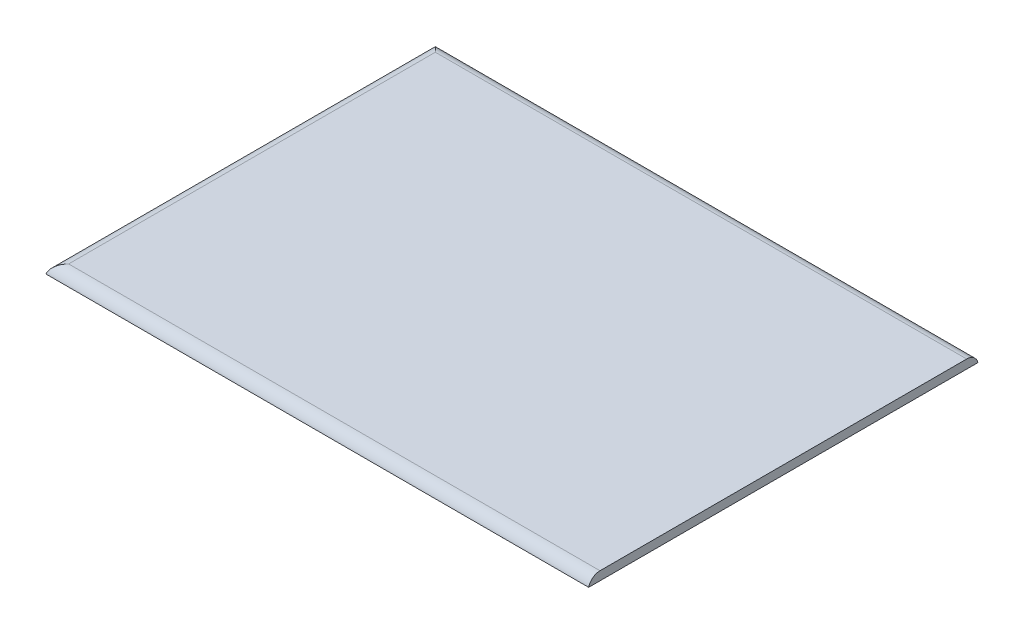
ISO-10303-21;
HEADER;
FILE_DESCRIPTION(('STEP AP214'),'2;1');
FILE_NAME('part.step','',(''),(''),'','','');
FILE_SCHEMA(('AUTOMOTIVE_DESIGN { 1 0 10303 214 1 1 1 1 }'));
ENDSEC;
DATA;
#1=APPLICATION_CONTEXT('core data for automotive mechanical design processes');
#2=APPLICATION_PROTOCOL_DEFINITION('international standard','automotive_design',2000,#1);
#3=PRODUCT_CONTEXT('',#1,'mechanical');
#4=PRODUCT('Part','Part','',(#3));
#5=PRODUCT_RELATED_PRODUCT_CATEGORY('part','',(#4));
#6=PRODUCT_DEFINITION_FORMATION('','',#4);
#7=PRODUCT_DEFINITION_CONTEXT('part definition',#1,'design');
#8=PRODUCT_DEFINITION('design','',#6,#7);
#9=PRODUCT_DEFINITION_SHAPE('','',#8);
#10=(LENGTH_UNIT() NAMED_UNIT(*) SI_UNIT(.MILLI.,.METRE.));
#11=(NAMED_UNIT(*) PLANE_ANGLE_UNIT() SI_UNIT($,.RADIAN.));
#12=(NAMED_UNIT(*) SI_UNIT($,.STERADIAN.) SOLID_ANGLE_UNIT());
#13=UNCERTAINTY_MEASURE_WITH_UNIT(LENGTH_MEASURE(1.E-05),#10,'distance_accuracy_value','');
#14=(GEOMETRIC_REPRESENTATION_CONTEXT(3) GLOBAL_UNCERTAINTY_ASSIGNED_CONTEXT((#13)) GLOBAL_UNIT_ASSIGNED_CONTEXT((#10,
#11,#12)) REPRESENTATION_CONTEXT('',''));
#15=CARTESIAN_POINT('',(0.,0.,0.));
#16=DIRECTION('',(0.,0.,1.));
#17=DIRECTION('',(1.,0.,0.));
#18=AXIS2_PLACEMENT_3D('',#15,#16,#17);
#19=CARTESIAN_POINT('',(46.5,1.25,-33.4));
#20=DIRECTION('',(-1.,0.,0.));
#21=DIRECTION('',(0.,0.,1.));
#22=AXIS2_PLACEMENT_3D('',#19,#20,#21);
#23=PLANE('',#22);
#24=DIRECTION('',(0.,0.,1.));
#25=VECTOR('',#24,1.);
#26=CARTESIAN_POINT('',(46.5,-0.25,33.4));
#27=LINE('',#26,#25);
#28=CARTESIAN_POINT('',(46.5,-0.25,-33.3364916731037));
#29=VERTEX_POINT('',#28);
#30=CARTESIAN_POINT('',(46.5,-0.25,33.3364916731037));
#31=VERTEX_POINT('',#30);
#32=EDGE_CURVE('E88',#29,#31,#27,.T.);
#33=ORIENTED_EDGE('',*,*,#32,.F.);
#34=CARTESIAN_POINT('',(46.5,-0.75,-31.4));
#35=DIRECTION('',(-1.,0.,0.));
#36=DIRECTION('',(0.,0.,1.));
#37=AXIS2_PLACEMENT_3D('',#34,#35,#36);
#38=CIRCLE('',#37,2.);
#39=CARTESIAN_POINT('',(46.5,1.25,-31.4));
#40=VERTEX_POINT('',#39);
#41=EDGE_CURVE('E55',#29,#40,#38,.F.);
#42=ORIENTED_EDGE('',*,*,#41,.T.);
#43=DIRECTION('',(0.,0.,-1.));
#44=VECTOR('',#43,1.);
#45=CARTESIAN_POINT('',(46.5,1.25,-33.4));
#46=LINE('',#45,#44);
#47=CARTESIAN_POINT('',(46.5,1.25,31.4));
#48=VERTEX_POINT('',#47);
#49=EDGE_CURVE('E114',#48,#40,#46,.T.);
#50=ORIENTED_EDGE('',*,*,#49,.F.);
#51=CARTESIAN_POINT('',(46.5,-0.75,31.4));
#52=DIRECTION('',(-1.,0.,0.));
#53=DIRECTION('',(0.,0.,1.));
#54=AXIS2_PLACEMENT_3D('',#51,#52,#53);
#55=CIRCLE('',#54,2.);
#56=EDGE_CURVE('E96',#48,#31,#55,.F.);
#57=ORIENTED_EDGE('',*,*,#56,.T.);
#58=EDGE_LOOP('',(#33,#42,#50,#57));
#59=FACE_BOUND('',#58,.T.);
#60=ADVANCED_FACE('F45',(#59),#23,.F.);
#61=CARTESIAN_POINT('',(0.,-0.75,31.4));
#62=DIRECTION('',(-1.,0.,0.));
#63=DIRECTION('',(0.,0.,1.));
#64=AXIS2_PLACEMENT_3D('',#61,#62,#63);
#65=CYLINDRICAL_SURFACE('',#64,2.);
#66=CARTESIAN_POINT('',(-44.5,-0.75,31.4));
#67=DIRECTION('',(-0.707106781186547,0.,-0.707106781186547));
#68=DIRECTION('',(-0.707106781186547,0.,0.707106781186547));
#69=AXIS2_PLACEMENT_3D('',#66,#67,#68);
#70=ELLIPSE('',#69,2.82842712474619,2.);
#71=CARTESIAN_POINT('',(-46.4364916731037,-0.25,33.3364916731037));
#72=VERTEX_POINT('',#71);
#73=CARTESIAN_POINT('',(-44.5,1.25,31.4));
#74=VERTEX_POINT('',#73);
#75=EDGE_CURVE('E111',#72,#74,#70,.T.);
#76=ORIENTED_EDGE('',*,*,#75,.F.);
#77=DIRECTION('',(-1.,0.,0.));
#78=VECTOR('',#77,1.);
#79=CARTESIAN_POINT('',(0.,-0.25,33.3364916731037));
#80=LINE('',#79,#78);
#81=EDGE_CURVE('E112',#72,#31,#80,.F.);
#82=ORIENTED_EDGE('',*,*,#81,.T.);
#83=ORIENTED_EDGE('',*,*,#56,.F.);
#84=DIRECTION('',(1.,0.,0.));
#85=VECTOR('',#84,1.);
#86=CARTESIAN_POINT('',(46.5,1.25,31.4));
#87=LINE('',#86,#85);
#88=EDGE_CURVE('E187',#74,#48,#87,.T.);
#89=ORIENTED_EDGE('',*,*,#88,.F.);
#90=EDGE_LOOP('',(#76,#82,#83,#89));
#91=FACE_BOUND('',#90,.T.);
#92=ADVANCED_FACE('F47',(#91),#65,.T.);
#93=CARTESIAN_POINT('',(-44.5,-0.75,0.));
#94=DIRECTION('',(0.,0.,-1.));
#95=DIRECTION('',(-1.,0.,0.));
#96=AXIS2_PLACEMENT_3D('',#93,#94,#95);
#97=CYLINDRICAL_SURFACE('',#96,2.);
#98=CARTESIAN_POINT('',(-44.5,-0.75,-31.4));
#99=DIRECTION('',(0.707106781186547,0.,-0.707106781186547));
#100=DIRECTION('',(-0.707106781186547,0.,-0.707106781186547));
#101=AXIS2_PLACEMENT_3D('',#98,#99,#100);
#102=ELLIPSE('',#101,2.82842712474619,2.);
#103=CARTESIAN_POINT('',(-46.4364916731037,-0.25,-33.3364916731037));
#104=VERTEX_POINT('',#103);
#105=CARTESIAN_POINT('',(-44.5,1.25,-31.4));
#106=VERTEX_POINT('',#105);
#107=EDGE_CURVE('E69',#104,#106,#102,.T.);
#108=ORIENTED_EDGE('',*,*,#107,.F.);
#109=DIRECTION('',(0.,0.,-1.));
#110=VECTOR('',#109,1.);
#111=CARTESIAN_POINT('',(-46.4364916731037,-0.25,0.));
#112=LINE('',#111,#110);
#113=EDGE_CURVE('E63',#104,#72,#112,.F.);
#114=ORIENTED_EDGE('',*,*,#113,.T.);
#115=ORIENTED_EDGE('',*,*,#75,.T.);
#116=DIRECTION('',(0.,0.,1.));
#117=VECTOR('',#116,1.);
#118=CARTESIAN_POINT('',(-44.5,1.25,33.4));
#119=LINE('',#118,#117);
#120=EDGE_CURVE('E190',#106,#74,#119,.T.);
#121=ORIENTED_EDGE('',*,*,#120,.F.);
#122=EDGE_LOOP('',(#108,#114,#115,#121));
#123=FACE_BOUND('',#122,.T.);
#124=ADVANCED_FACE('F200',(#123),#97,.T.);
#125=CARTESIAN_POINT('',(0.,-0.75,-31.4));
#126=DIRECTION('',(1.,0.,0.));
#127=DIRECTION('',(0.,0.,-1.));
#128=AXIS2_PLACEMENT_3D('',#125,#126,#127);
#129=CYLINDRICAL_SURFACE('',#128,2.);
#130=ORIENTED_EDGE('',*,*,#41,.F.);
#131=DIRECTION('',(1.,0.,0.));
#132=VECTOR('',#131,1.);
#133=CARTESIAN_POINT('',(0.,-0.25,-33.3364916731037));
#134=LINE('',#133,#132);
#135=EDGE_CURVE('E11',#29,#104,#134,.F.);
#136=ORIENTED_EDGE('',*,*,#135,.T.);
#137=ORIENTED_EDGE('',*,*,#107,.T.);
#138=DIRECTION('',(-1.,0.,0.));
#139=VECTOR('',#138,1.);
#140=CARTESIAN_POINT('',(-46.5,1.25,-31.4));
#141=LINE('',#140,#139);
#142=EDGE_CURVE('E102',#40,#106,#141,.T.);
#143=ORIENTED_EDGE('',*,*,#142,.F.);
#144=EDGE_LOOP('',(#130,#136,#137,#143));
#145=FACE_BOUND('',#144,.T.);
#146=ADVANCED_FACE('F100',(#145),#129,.T.);
#147=CARTESIAN_POINT('',(0.,1.25,0.));
#148=DIRECTION('',(0.,1.,0.));
#149=DIRECTION('',(0.,0.,1.));
#150=AXIS2_PLACEMENT_3D('',#147,#148,#149);
#151=PLANE('',#150);
#152=ORIENTED_EDGE('',*,*,#49,.T.);
#153=ORIENTED_EDGE('',*,*,#142,.T.);
#154=ORIENTED_EDGE('',*,*,#120,.T.);
#155=ORIENTED_EDGE('',*,*,#88,.T.);
#156=EDGE_LOOP('',(#152,#153,#154,#155));
#157=FACE_BOUND('',#156,.T.);
#158=ADVANCED_FACE('F195',(#157),#151,.T.);
#159=CARTESIAN_POINT('',(0.,-0.25,0.));
#160=DIRECTION('',(0.,-1.,0.));
#161=DIRECTION('',(0.,0.,-1.));
#162=AXIS2_PLACEMENT_3D('',#159,#160,#161);
#163=PLANE('',#162);
#164=CARTESIAN_POINT('',(-37.55,-0.25,-19.6135083268963));
#165=DIRECTION('',(0.,-1.,0.));
#166=DIRECTION('',(0.,0.,-1.));
#167=AXIS2_PLACEMENT_3D('',#164,#165,#166);
#168=CIRCLE('',#167,2.5);
#169=CARTESIAN_POINT('',(-37.55,-0.25,-22.1135083268963));
#170=VERTEX_POINT('',#169);
#171=EDGE_CURVE('E336',#170,#170,#168,.T.);
#172=ORIENTED_EDGE('',*,*,#171,.F.);
#173=EDGE_LOOP('',(#172));
#174=FACE_BOUND('',#173,.T.);
#175=CARTESIAN_POINT('',(17.55,-0.25,-19.6135083268963));
#176=DIRECTION('',(0.,-1.,0.));
#177=DIRECTION('',(0.,0.,-1.));
#178=AXIS2_PLACEMENT_3D('',#175,#176,#177);
#179=CIRCLE('',#178,2.5);
#180=CARTESIAN_POINT('',(17.55,-0.25,-22.1135083268963));
#181=VERTEX_POINT('',#180);
#182=EDGE_CURVE('E326',#181,#181,#179,.T.);
#183=ORIENTED_EDGE('',*,*,#182,.F.);
#184=EDGE_LOOP('',(#183));
#185=FACE_BOUND('',#184,.T.);
#186=CARTESIAN_POINT('',(17.55,-0.25,26.4864916731037));
#187=DIRECTION('',(0.,-1.,0.));
#188=DIRECTION('',(0.,0.,-1.));
#189=AXIS2_PLACEMENT_3D('',#186,#187,#188);
#190=CIRCLE('',#189,2.5);
#191=CARTESIAN_POINT('',(17.55,-0.25,23.9864916731037));
#192=VERTEX_POINT('',#191);
#193=EDGE_CURVE('E317',#192,#192,#190,.T.);
#194=ORIENTED_EDGE('',*,*,#193,.F.);
#195=EDGE_LOOP('',(#194));
#196=FACE_BOUND('',#195,.T.);
#197=CARTESIAN_POINT('',(-37.55,-0.25,26.4864916731037));
#198=DIRECTION('',(0.,-1.,0.));
#199=DIRECTION('',(0.,0.,-1.));
#200=AXIS2_PLACEMENT_3D('',#197,#198,#199);
#201=CIRCLE('',#200,2.5);
#202=CARTESIAN_POINT('',(-37.55,-0.25,23.9864916731037));
#203=VERTEX_POINT('',#202);
#204=EDGE_CURVE('E320',#203,#203,#201,.T.);
#205=ORIENTED_EDGE('',*,*,#204,.F.);
#206=EDGE_LOOP('',(#205));
#207=FACE_BOUND('',#206,.T.);
#208=CARTESIAN_POINT('',(-43.5,-0.25,-30.4));
#209=DIRECTION('',(0.,-1.,0.));
#210=DIRECTION('',(0.,0.,-1.));
#211=AXIS2_PLACEMENT_3D('',#208,#209,#210);
#212=CIRCLE('',#211,1.00000000000001);
#213=CARTESIAN_POINT('',(-43.5,-0.25,-31.4));
#214=VERTEX_POINT('',#213);
#215=EDGE_CURVE('E168',#214,#214,#212,.T.);
#216=ORIENTED_EDGE('',*,*,#215,.F.);
#217=EDGE_LOOP('',(#216));
#218=FACE_BOUND('',#217,.T.);
#219=CARTESIAN_POINT('',(43.5,-0.25,-30.4));
#220=DIRECTION('',(0.,-1.,0.));
#221=DIRECTION('',(0.,0.,-1.));
#222=AXIS2_PLACEMENT_3D('',#219,#220,#221);
#223=CIRCLE('',#222,0.999999999999998);
#224=CARTESIAN_POINT('',(43.5,-0.25,-31.4));
#225=VERTEX_POINT('',#224);
#226=EDGE_CURVE('E160',#225,#225,#223,.T.);
#227=ORIENTED_EDGE('',*,*,#226,.F.);
#228=EDGE_LOOP('',(#227));
#229=FACE_BOUND('',#228,.T.);
#230=CARTESIAN_POINT('',(43.5,-0.25,30.4));
#231=DIRECTION('',(0.,-1.,0.));
#232=DIRECTION('',(0.,0.,-1.));
#233=AXIS2_PLACEMENT_3D('',#230,#231,#232);
#234=CIRCLE('',#233,0.999999999999992);
#235=CARTESIAN_POINT('',(43.5,-0.25,29.4));
#236=VERTEX_POINT('',#235);
#237=EDGE_CURVE('E151',#236,#236,#234,.T.);
#238=ORIENTED_EDGE('',*,*,#237,.F.);
#239=EDGE_LOOP('',(#238));
#240=FACE_BOUND('',#239,.T.);
#241=CARTESIAN_POINT('',(-43.5,-0.25,30.4));
#242=DIRECTION('',(0.,-1.,0.));
#243=DIRECTION('',(0.,0.,-1.));
#244=AXIS2_PLACEMENT_3D('',#241,#242,#243);
#245=CIRCLE('',#244,0.999999999999998);
#246=CARTESIAN_POINT('',(-43.5,-0.25,29.4));
#247=VERTEX_POINT('',#246);
#248=EDGE_CURVE('E155',#247,#247,#245,.T.);
#249=ORIENTED_EDGE('',*,*,#248,.F.);
#250=EDGE_LOOP('',(#249));
#251=FACE_BOUND('',#250,.T.);
#252=ORIENTED_EDGE('',*,*,#113,.F.);
#253=ORIENTED_EDGE('',*,*,#135,.F.);
#254=ORIENTED_EDGE('',*,*,#32,.T.);
#255=ORIENTED_EDGE('',*,*,#81,.F.);
#256=EDGE_LOOP('',(#252,#253,#254,#255));
#257=FACE_BOUND('',#256,.T.);
#258=ADVANCED_FACE('F87',(#174,#185,#196,#207,#218,#229,#240,#251,#257),#163,.T.);
#259=CARTESIAN_POINT('',(-43.5,0.5,30.4));
#260=DIRECTION('',(0.,-1.,0.));
#261=DIRECTION('',(0.,0.,-1.));
#262=AXIS2_PLACEMENT_3D('',#259,#260,#261);
#263=CYLINDRICAL_SURFACE('',#262,0.999999999999998);
#264=CARTESIAN_POINT('',(-43.5,0.5,30.4));
#265=DIRECTION('',(0.,-1.,0.));
#266=DIRECTION('',(0.,0.,-1.));
#267=AXIS2_PLACEMENT_3D('',#264,#265,#266);
#268=CIRCLE('',#267,0.999999999999998);
#269=CARTESIAN_POINT('',(-43.5,0.5,29.4));
#270=VERTEX_POINT('',#269);
#271=EDGE_CURVE('E98',#270,#270,#268,.T.);
#272=ORIENTED_EDGE('',*,*,#271,.F.);
#273=EDGE_LOOP('',(#272));
#274=FACE_BOUND('',#273,.T.);
#275=ORIENTED_EDGE('',*,*,#248,.T.);
#276=EDGE_LOOP('',(#275));
#277=FACE_BOUND('',#276,.T.);
#278=ADVANCED_FACE('F216',(#274,#277),#263,.F.);
#279=CARTESIAN_POINT('',(-43.5,0.5,30.4));
#280=DIRECTION('',(0.,-1.,0.));
#281=DIRECTION('',(0.,0.,-1.));
#282=AXIS2_PLACEMENT_3D('',#279,#280,#281);
#283=PLANE('',#282);
#284=ORIENTED_EDGE('',*,*,#271,.T.);
#285=EDGE_LOOP('',(#284));
#286=FACE_BOUND('',#285,.T.);
#287=ADVANCED_FACE('F220',(#286),#283,.T.);
#288=CARTESIAN_POINT('',(43.5,0.5,30.4));
#289=DIRECTION('',(0.,-1.,0.));
#290=DIRECTION('',(0.,0.,-1.));
#291=AXIS2_PLACEMENT_3D('',#288,#289,#290);
#292=CYLINDRICAL_SURFACE('',#291,0.999999999999992);
#293=CARTESIAN_POINT('',(43.5,0.5,30.4));
#294=DIRECTION('',(0.,-1.,0.));
#295=DIRECTION('',(0.,0.,-1.));
#296=AXIS2_PLACEMENT_3D('',#293,#294,#295);
#297=CIRCLE('',#296,0.999999999999992);
#298=CARTESIAN_POINT('',(43.5,0.5,29.4));
#299=VERTEX_POINT('',#298);
#300=EDGE_CURVE('E156',#299,#299,#297,.T.);
#301=ORIENTED_EDGE('',*,*,#300,.F.);
#302=EDGE_LOOP('',(#301));
#303=FACE_BOUND('',#302,.T.);
#304=ORIENTED_EDGE('',*,*,#237,.T.);
#305=EDGE_LOOP('',(#304));
#306=FACE_BOUND('',#305,.T.);
#307=ADVANCED_FACE('F224',(#303,#306),#292,.F.);
#308=CARTESIAN_POINT('',(43.5,0.5,30.4));
#309=DIRECTION('',(0.,-1.,0.));
#310=DIRECTION('',(0.,0.,-1.));
#311=AXIS2_PLACEMENT_3D('',#308,#309,#310);
#312=PLANE('',#311);
#313=ORIENTED_EDGE('',*,*,#300,.T.);
#314=EDGE_LOOP('',(#313));
#315=FACE_BOUND('',#314,.T.);
#316=ADVANCED_FACE('F242',(#315),#312,.T.);
#317=CARTESIAN_POINT('',(43.5,0.5,-30.4));
#318=DIRECTION('',(0.,-1.,0.));
#319=DIRECTION('',(0.,0.,-1.));
#320=AXIS2_PLACEMENT_3D('',#317,#318,#319);
#321=CYLINDRICAL_SURFACE('',#320,0.999999999999998);
#322=CARTESIAN_POINT('',(43.5,0.5,-30.4));
#323=DIRECTION('',(0.,-1.,0.));
#324=DIRECTION('',(0.,0.,-1.));
#325=AXIS2_PLACEMENT_3D('',#322,#323,#324);
#326=CIRCLE('',#325,0.999999999999998);
#327=CARTESIAN_POINT('',(43.5,0.5,-31.4));
#328=VERTEX_POINT('',#327);
#329=EDGE_CURVE('E164',#328,#328,#326,.T.);
#330=ORIENTED_EDGE('',*,*,#329,.F.);
#331=EDGE_LOOP('',(#330));
#332=FACE_BOUND('',#331,.T.);
#333=ORIENTED_EDGE('',*,*,#226,.T.);
#334=EDGE_LOOP('',(#333));
#335=FACE_BOUND('',#334,.T.);
#336=ADVANCED_FACE('F238',(#332,#335),#321,.F.);
#337=CARTESIAN_POINT('',(43.5,0.5,-30.4));
#338=DIRECTION('',(0.,-1.,0.));
#339=DIRECTION('',(0.,0.,-1.));
#340=AXIS2_PLACEMENT_3D('',#337,#338,#339);
#341=PLANE('',#340);
#342=ORIENTED_EDGE('',*,*,#329,.T.);
#343=EDGE_LOOP('',(#342));
#344=FACE_BOUND('',#343,.T.);
#345=ADVANCED_FACE('F234',(#344),#341,.T.);
#346=CARTESIAN_POINT('',(-43.5,0.5,-30.4));
#347=DIRECTION('',(0.,-1.,0.));
#348=DIRECTION('',(0.,0.,-1.));
#349=AXIS2_PLACEMENT_3D('',#346,#347,#348);
#350=CYLINDRICAL_SURFACE('',#349,1.00000000000001);
#351=CARTESIAN_POINT('',(-43.5,0.5,-30.4));
#352=DIRECTION('',(0.,-1.,0.));
#353=DIRECTION('',(0.,0.,-1.));
#354=AXIS2_PLACEMENT_3D('',#351,#352,#353);
#355=CIRCLE('',#354,1.00000000000001);
#356=CARTESIAN_POINT('',(-43.5,0.5,-31.4));
#357=VERTEX_POINT('',#356);
#358=EDGE_CURVE('E150',#357,#357,#355,.T.);
#359=ORIENTED_EDGE('',*,*,#358,.F.);
#360=EDGE_LOOP('',(#359));
#361=FACE_BOUND('',#360,.T.);
#362=ORIENTED_EDGE('',*,*,#215,.T.);
#363=EDGE_LOOP('',(#362));
#364=FACE_BOUND('',#363,.T.);
#365=ADVANCED_FACE('F230',(#361,#364),#350,.F.);
#366=CARTESIAN_POINT('',(-43.5,0.5,-30.4));
#367=DIRECTION('',(0.,-1.,0.));
#368=DIRECTION('',(0.,0.,-1.));
#369=AXIS2_PLACEMENT_3D('',#366,#367,#368);
#370=PLANE('',#369);
#371=ORIENTED_EDGE('',*,*,#358,.T.);
#372=EDGE_LOOP('',(#371));
#373=FACE_BOUND('',#372,.T.);
#374=ADVANCED_FACE('F226',(#373),#370,.T.);
#375=CARTESIAN_POINT('',(-37.55,-2.05,-19.6135083268963));
#376=DIRECTION('',(0.,1.,0.));
#377=DIRECTION('',(0.,0.,1.));
#378=AXIS2_PLACEMENT_3D('',#375,#376,#377);
#379=CYLINDRICAL_SURFACE('',#378,2.5);
#380=CARTESIAN_POINT('',(-37.55,-2.05,-19.6135083268963));
#381=DIRECTION('',(0.,-1.,0.));
#382=DIRECTION('',(0.,0.,-1.));
#383=AXIS2_PLACEMENT_3D('',#380,#381,#382);
#384=CIRCLE('',#383,2.5);
#385=CARTESIAN_POINT('',(-37.55,-2.05,-22.1135083268963));
#386=VERTEX_POINT('',#385);
#387=EDGE_CURVE('E340',#386,#386,#384,.T.);
#388=ORIENTED_EDGE('',*,*,#387,.F.);
#389=EDGE_LOOP('',(#388));
#390=FACE_BOUND('',#389,.T.);
#391=ORIENTED_EDGE('',*,*,#171,.T.);
#392=EDGE_LOOP('',(#391));
#393=FACE_BOUND('',#392,.T.);
#394=ADVANCED_FACE('F229',(#390,#393),#379,.T.);
#395=CARTESIAN_POINT('',(-37.55,-2.05,-19.6135083268963));
#396=DIRECTION('',(0.,-1.,0.));
#397=DIRECTION('',(0.,0.,-1.));
#398=AXIS2_PLACEMENT_3D('',#395,#396,#397);
#399=PLANE('',#398);
#400=CARTESIAN_POINT('',(-37.55,-2.05,-19.6135083268963));
#401=DIRECTION('',(0.,-1.,0.));
#402=DIRECTION('',(0.,0.,-1.));
#403=AXIS2_PLACEMENT_3D('',#400,#401,#402);
#404=CIRCLE('',#403,1.45);
#405=CARTESIAN_POINT('',(-37.55,-2.05,-21.0635083268963));
#406=VERTEX_POINT('',#405);
#407=EDGE_CURVE('E116',#406,#406,#404,.T.);
#408=ORIENTED_EDGE('',*,*,#407,.F.);
#409=EDGE_LOOP('',(#408));
#410=FACE_BOUND('',#409,.T.);
#411=ORIENTED_EDGE('',*,*,#387,.T.);
#412=EDGE_LOOP('',(#411));
#413=FACE_BOUND('',#412,.T.);
#414=ADVANCED_FACE('F288',(#410,#413),#399,.T.);
#415=CARTESIAN_POINT('',(17.55,-2.05,-19.6135083268963));
#416=DIRECTION('',(0.,1.,0.));
#417=DIRECTION('',(0.,0.,1.));
#418=AXIS2_PLACEMENT_3D('',#415,#416,#417);
#419=CYLINDRICAL_SURFACE('',#418,2.5);
#420=CARTESIAN_POINT('',(17.55,-2.05,-19.6135083268963));
#421=DIRECTION('',(0.,-1.,0.));
#422=DIRECTION('',(0.,0.,-1.));
#423=AXIS2_PLACEMENT_3D('',#420,#421,#422);
#424=CIRCLE('',#423,2.5);
#425=CARTESIAN_POINT('',(17.55,-2.05,-22.1135083268963));
#426=VERTEX_POINT('',#425);
#427=EDGE_CURVE('E332',#426,#426,#424,.T.);
#428=ORIENTED_EDGE('',*,*,#427,.F.);
#429=EDGE_LOOP('',(#428));
#430=FACE_BOUND('',#429,.T.);
#431=ORIENTED_EDGE('',*,*,#182,.T.);
#432=EDGE_LOOP('',(#431));
#433=FACE_BOUND('',#432,.T.);
#434=ADVANCED_FACE('F291',(#430,#433),#419,.T.);
#435=CARTESIAN_POINT('',(17.55,-2.05,-19.6135083268963));
#436=DIRECTION('',(0.,-1.,0.));
#437=DIRECTION('',(0.,0.,-1.));
#438=AXIS2_PLACEMENT_3D('',#435,#436,#437);
#439=PLANE('',#438);
#440=CARTESIAN_POINT('',(17.55,-2.05,-19.6135083268963));
#441=DIRECTION('',(0.,-1.,0.));
#442=DIRECTION('',(0.,0.,-1.));
#443=AXIS2_PLACEMENT_3D('',#440,#441,#442);
#444=CIRCLE('',#443,1.45);
#445=CARTESIAN_POINT('',(17.55,-2.05,-21.0635083268963));
#446=VERTEX_POINT('',#445);
#447=EDGE_CURVE('E120',#446,#446,#444,.T.);
#448=ORIENTED_EDGE('',*,*,#447,.F.);
#449=EDGE_LOOP('',(#448));
#450=FACE_BOUND('',#449,.T.);
#451=ORIENTED_EDGE('',*,*,#427,.T.);
#452=EDGE_LOOP('',(#451));
#453=FACE_BOUND('',#452,.T.);
#454=ADVANCED_FACE('F296',(#450,#453),#439,.T.);
#455=CARTESIAN_POINT('',(17.55,-2.05,26.4864916731037));
#456=DIRECTION('',(0.,1.,0.));
#457=DIRECTION('',(0.,0.,1.));
#458=AXIS2_PLACEMENT_3D('',#455,#456,#457);
#459=CYLINDRICAL_SURFACE('',#458,2.5);
#460=CARTESIAN_POINT('',(17.55,-2.05,26.4864916731037));
#461=DIRECTION('',(0.,-1.,0.));
#462=DIRECTION('',(0.,0.,-1.));
#463=AXIS2_PLACEMENT_3D('',#460,#461,#462);
#464=CIRCLE('',#463,2.5);
#465=CARTESIAN_POINT('',(17.55,-2.05,23.9864916731037));
#466=VERTEX_POINT('',#465);
#467=EDGE_CURVE('E314',#466,#466,#464,.T.);
#468=ORIENTED_EDGE('',*,*,#467,.F.);
#469=EDGE_LOOP('',(#468));
#470=FACE_BOUND('',#469,.T.);
#471=ORIENTED_EDGE('',*,*,#193,.T.);
#472=EDGE_LOOP('',(#471));
#473=FACE_BOUND('',#472,.T.);
#474=ADVANCED_FACE('F299',(#470,#473),#459,.T.);
#475=CARTESIAN_POINT('',(17.55,-2.05,26.4864916731037));
#476=DIRECTION('',(0.,-1.,0.));
#477=DIRECTION('',(0.,0.,-1.));
#478=AXIS2_PLACEMENT_3D('',#475,#476,#477);
#479=PLANE('',#478);
#480=CARTESIAN_POINT('',(17.55,-2.05,26.4864916731037));
#481=DIRECTION('',(0.,-1.,0.));
#482=DIRECTION('',(0.,0.,-1.));
#483=AXIS2_PLACEMENT_3D('',#480,#481,#482);
#484=CIRCLE('',#483,1.45);
#485=CARTESIAN_POINT('',(17.55,-2.05,25.0364916731037));
#486=VERTEX_POINT('',#485);
#487=EDGE_CURVE('E124',#486,#486,#484,.T.);
#488=ORIENTED_EDGE('',*,*,#487,.F.);
#489=EDGE_LOOP('',(#488));
#490=FACE_BOUND('',#489,.T.);
#491=ORIENTED_EDGE('',*,*,#467,.T.);
#492=EDGE_LOOP('',(#491));
#493=FACE_BOUND('',#492,.T.);
#494=ADVANCED_FACE('F283',(#490,#493),#479,.T.);
#495=CARTESIAN_POINT('',(-37.55,-2.05,26.4864916731037));
#496=DIRECTION('',(0.,1.,0.));
#497=DIRECTION('',(0.,0.,1.));
#498=AXIS2_PLACEMENT_3D('',#495,#496,#497);
#499=CYLINDRICAL_SURFACE('',#498,2.5);
#500=CARTESIAN_POINT('',(-37.55,-2.05,26.4864916731037));
#501=DIRECTION('',(0.,-1.,0.));
#502=DIRECTION('',(0.,0.,-1.));
#503=AXIS2_PLACEMENT_3D('',#500,#501,#502);
#504=CIRCLE('',#503,2.5);
#505=CARTESIAN_POINT('',(-37.55,-2.05,23.9864916731037));
#506=VERTEX_POINT('',#505);
#507=EDGE_CURVE('E121',#506,#506,#504,.T.);
#508=ORIENTED_EDGE('',*,*,#507,.F.);
#509=EDGE_LOOP('',(#508));
#510=FACE_BOUND('',#509,.T.);
#511=ORIENTED_EDGE('',*,*,#204,.T.);
#512=EDGE_LOOP('',(#511));
#513=FACE_BOUND('',#512,.T.);
#514=ADVANCED_FACE('F280',(#510,#513),#499,.T.);
#515=CARTESIAN_POINT('',(-37.55,-2.05,26.4864916731037));
#516=DIRECTION('',(0.,-1.,0.));
#517=DIRECTION('',(0.,0.,-1.));
#518=AXIS2_PLACEMENT_3D('',#515,#516,#517);
#519=PLANE('',#518);
#520=CARTESIAN_POINT('',(-37.55,-2.05,26.4864916731037));
#521=DIRECTION('',(0.,-1.,0.));
#522=DIRECTION('',(0.,0.,-1.));
#523=AXIS2_PLACEMENT_3D('',#520,#521,#522);
#524=CIRCLE('',#523,1.45);
#525=CARTESIAN_POINT('',(-37.55,-2.05,25.0364916731037));
#526=VERTEX_POINT('',#525);
#527=EDGE_CURVE('E49',#526,#526,#524,.T.);
#528=ORIENTED_EDGE('',*,*,#527,.F.);
#529=EDGE_LOOP('',(#528));
#530=FACE_BOUND('',#529,.T.);
#531=ORIENTED_EDGE('',*,*,#507,.T.);
#532=EDGE_LOOP('',(#531));
#533=FACE_BOUND('',#532,.T.);
#534=ADVANCED_FACE('F262',(#530,#533),#519,.T.);
#535=CARTESIAN_POINT('',(-37.55,-5.25,-19.6135083268963));
#536=DIRECTION('',(0.,-1.,0.));
#537=DIRECTION('',(0.,0.,-1.));
#538=AXIS2_PLACEMENT_3D('',#535,#536,#537);
#539=PLANE('',#538);
#540=CARTESIAN_POINT('',(-37.55,-5.25,-19.6135083268963));
#541=DIRECTION('',(0.,-1.,0.));
#542=DIRECTION('',(0.,0.,-1.));
#543=AXIS2_PLACEMENT_3D('',#540,#541,#542);
#544=CIRCLE('',#543,1.45);
#545=CARTESIAN_POINT('',(-37.55,-5.25,-21.0635083268963));
#546=VERTEX_POINT('',#545);
#547=EDGE_CURVE('E131',#546,#546,#544,.T.);
#548=ORIENTED_EDGE('',*,*,#547,.T.);
#549=EDGE_LOOP('',(#548));
#550=FACE_BOUND('',#549,.T.);
#551=ADVANCED_FACE('F258',(#550),#539,.T.);
#552=CARTESIAN_POINT('',(-37.55,-5.25,-19.6135083268963));
#553=DIRECTION('',(0.,1.,0.));
#554=DIRECTION('',(0.,0.,1.));
#555=AXIS2_PLACEMENT_3D('',#552,#553,#554);
#556=CYLINDRICAL_SURFACE('',#555,1.45);
#557=ORIENTED_EDGE('',*,*,#407,.T.);
#558=EDGE_LOOP('',(#557));
#559=FACE_BOUND('',#558,.T.);
#560=ORIENTED_EDGE('',*,*,#547,.F.);
#561=EDGE_LOOP('',(#560));
#562=FACE_BOUND('',#561,.T.);
#563=ADVANCED_FACE('F261',(#559,#562),#556,.T.);
#564=CARTESIAN_POINT('',(17.55,-5.25,-19.6135083268963));
#565=DIRECTION('',(0.,-1.,0.));
#566=DIRECTION('',(0.,0.,-1.));
#567=AXIS2_PLACEMENT_3D('',#564,#565,#566);
#568=PLANE('',#567);
#569=CARTESIAN_POINT('',(17.55,-5.25,-19.6135083268963));
#570=DIRECTION('',(0.,-1.,0.));
#571=DIRECTION('',(0.,0.,-1.));
#572=AXIS2_PLACEMENT_3D('',#569,#570,#571);
#573=CIRCLE('',#572,1.45);
#574=CARTESIAN_POINT('',(17.55,-5.25,-21.0635083268963));
#575=VERTEX_POINT('',#574);
#576=EDGE_CURVE('E136',#575,#575,#573,.T.);
#577=ORIENTED_EDGE('',*,*,#576,.T.);
#578=EDGE_LOOP('',(#577));
#579=FACE_BOUND('',#578,.T.);
#580=ADVANCED_FACE('F265',(#579),#568,.T.);
#581=CARTESIAN_POINT('',(17.55,-5.25,-19.6135083268963));
#582=DIRECTION('',(0.,1.,0.));
#583=DIRECTION('',(0.,0.,1.));
#584=AXIS2_PLACEMENT_3D('',#581,#582,#583);
#585=CYLINDRICAL_SURFACE('',#584,1.45);
#586=ORIENTED_EDGE('',*,*,#447,.T.);
#587=EDGE_LOOP('',(#586));
#588=FACE_BOUND('',#587,.T.);
#589=ORIENTED_EDGE('',*,*,#576,.F.);
#590=EDGE_LOOP('',(#589));
#591=FACE_BOUND('',#590,.T.);
#592=ADVANCED_FACE('F269',(#588,#591),#585,.T.);
#593=CARTESIAN_POINT('',(17.55,-5.25,26.4864916731037));
#594=DIRECTION('',(0.,-1.,0.));
#595=DIRECTION('',(0.,0.,-1.));
#596=AXIS2_PLACEMENT_3D('',#593,#594,#595);
#597=PLANE('',#596);
#598=CARTESIAN_POINT('',(17.55,-5.25,26.4864916731037));
#599=DIRECTION('',(0.,-1.,0.));
#600=DIRECTION('',(0.,0.,-1.));
#601=AXIS2_PLACEMENT_3D('',#598,#599,#600);
#602=CIRCLE('',#601,1.45);
#603=CARTESIAN_POINT('',(17.55,-5.25,25.0364916731037));
#604=VERTEX_POINT('',#603);
#605=EDGE_CURVE('E142',#604,#604,#602,.T.);
#606=ORIENTED_EDGE('',*,*,#605,.T.);
#607=EDGE_LOOP('',(#606));
#608=FACE_BOUND('',#607,.T.);
#609=ADVANCED_FACE('F273',(#608),#597,.T.);
#610=CARTESIAN_POINT('',(17.55,-5.25,26.4864916731037));
#611=DIRECTION('',(0.,1.,0.));
#612=DIRECTION('',(0.,0.,1.));
#613=AXIS2_PLACEMENT_3D('',#610,#611,#612);
#614=CYLINDRICAL_SURFACE('',#613,1.45);
#615=ORIENTED_EDGE('',*,*,#487,.T.);
#616=EDGE_LOOP('',(#615));
#617=FACE_BOUND('',#616,.T.);
#618=ORIENTED_EDGE('',*,*,#605,.F.);
#619=EDGE_LOOP('',(#618));
#620=FACE_BOUND('',#619,.T.);
#621=ADVANCED_FACE('F256',(#617,#620),#614,.T.);
#622=CARTESIAN_POINT('',(-37.55,-5.25,26.4864916731037));
#623=DIRECTION('',(0.,-1.,0.));
#624=DIRECTION('',(0.,0.,-1.));
#625=AXIS2_PLACEMENT_3D('',#622,#623,#624);
#626=PLANE('',#625);
#627=CARTESIAN_POINT('',(-37.55,-5.25,26.4864916731037));
#628=DIRECTION('',(0.,-1.,0.));
#629=DIRECTION('',(0.,0.,-1.));
#630=AXIS2_PLACEMENT_3D('',#627,#628,#629);
#631=CIRCLE('',#630,1.45);
#632=CARTESIAN_POINT('',(-37.55,-5.25,25.0364916731037));
#633=VERTEX_POINT('',#632);
#634=EDGE_CURVE('E146',#633,#633,#631,.T.);
#635=ORIENTED_EDGE('',*,*,#634,.T.);
#636=EDGE_LOOP('',(#635));
#637=FACE_BOUND('',#636,.T.);
#638=ADVANCED_FACE('F253',(#637),#626,.T.);
#639=CARTESIAN_POINT('',(-37.55,-5.25,26.4864916731037));
#640=DIRECTION('',(0.,1.,0.));
#641=DIRECTION('',(0.,0.,1.));
#642=AXIS2_PLACEMENT_3D('',#639,#640,#641);
#643=CYLINDRICAL_SURFACE('',#642,1.45);
#644=ORIENTED_EDGE('',*,*,#527,.T.);
#645=EDGE_LOOP('',(#644));
#646=FACE_BOUND('',#645,.T.);
#647=ORIENTED_EDGE('',*,*,#634,.F.);
#648=EDGE_LOOP('',(#647));
#649=FACE_BOUND('',#648,.T.);
#650=ADVANCED_FACE('F250',(#646,#649),#643,.T.);
#651=CLOSED_SHELL('',(#60,#92,#124,#146,#158,#258,#278,#287,#307,#316,#336,#345,#365,#374,#394,
#414,#434,#454,#474,#494,#514,#534,#551,#563,#580,#592,#609,#621,#638,#650));
#652=MANIFOLD_SOLID_BREP('B2',#651);
#653=ADVANCED_BREP_SHAPE_REPRESENTATION('',(#18,#652),#14);
#654=SHAPE_DEFINITION_REPRESENTATION(#9,#653);
ENDSEC;
END-ISO-10303-21;
